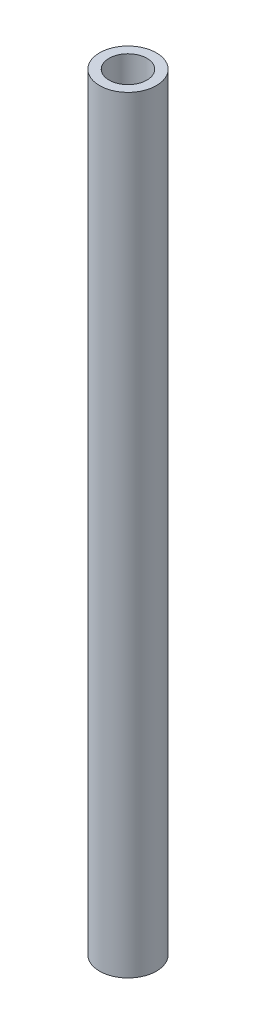
ISO-10303-21;
HEADER;
FILE_DESCRIPTION(('STEP AP214'),'2;1');
FILE_NAME('part.step','',(''),(''),'','','');
FILE_SCHEMA(('AUTOMOTIVE_DESIGN { 1 0 10303 214 1 1 1 1 }'));
ENDSEC;
DATA;
#1=APPLICATION_CONTEXT('core data for automotive mechanical design processes');
#2=APPLICATION_PROTOCOL_DEFINITION('international standard','automotive_design',2000,#1);
#3=PRODUCT_CONTEXT('',#1,'mechanical');
#4=PRODUCT('Part','Part','',(#3));
#5=PRODUCT_RELATED_PRODUCT_CATEGORY('part','',(#4));
#6=PRODUCT_DEFINITION_FORMATION('','',#4);
#7=PRODUCT_DEFINITION_CONTEXT('part definition',#1,'design');
#8=PRODUCT_DEFINITION('design','',#6,#7);
#9=PRODUCT_DEFINITION_SHAPE('','',#8);
#10=(LENGTH_UNIT() NAMED_UNIT(*) SI_UNIT(.MILLI.,.METRE.));
#11=(NAMED_UNIT(*) PLANE_ANGLE_UNIT() SI_UNIT($,.RADIAN.));
#12=(NAMED_UNIT(*) SI_UNIT($,.STERADIAN.) SOLID_ANGLE_UNIT());
#13=UNCERTAINTY_MEASURE_WITH_UNIT(LENGTH_MEASURE(1.E-05),#10,'distance_accuracy_value','');
#14=(GEOMETRIC_REPRESENTATION_CONTEXT(3) GLOBAL_UNCERTAINTY_ASSIGNED_CONTEXT((#13)) GLOBAL_UNIT_ASSIGNED_CONTEXT((#10,
#11,#12)) REPRESENTATION_CONTEXT('',''));
#15=CARTESIAN_POINT('',(0.,0.,0.));
#16=DIRECTION('',(0.,0.,1.));
#17=DIRECTION('',(1.,0.,0.));
#18=AXIS2_PLACEMENT_3D('',#15,#16,#17);
#19=CARTESIAN_POINT('',(-56.2916512459885,-69.6,50.));
#20=DIRECTION('',(0.,1.,0.));
#21=DIRECTION('',(0.,0.,1.));
#22=AXIS2_PLACEMENT_3D('',#19,#20,#21);
#23=PLANE('',#22);
#24=CARTESIAN_POINT('',(-56.2916512459885,-69.6,50.));
#25=DIRECTION('',(0.,1.,0.));
#26=DIRECTION('',(0.,0.,1.));
#27=AXIS2_PLACEMENT_3D('',#24,#25,#26);
#28=CIRCLE('',#27,3.);
#29=CARTESIAN_POINT('',(-56.2916512459885,-69.6,53.));
#30=VERTEX_POINT('',#29);
#31=EDGE_CURVE('E10',#30,#30,#28,.T.);
#32=ORIENTED_EDGE('',*,*,#31,.T.);
#33=EDGE_LOOP('',(#32));
#34=FACE_BOUND('',#33,.T.);
#35=CARTESIAN_POINT('',(-56.2916512459885,-69.6,50.));
#36=DIRECTION('',(0.,1.,0.));
#37=DIRECTION('',(0.,0.,1.));
#38=AXIS2_PLACEMENT_3D('',#35,#36,#37);
#39=CIRCLE('',#38,2.);
#40=CARTESIAN_POINT('',(-56.2916512459885,-69.6,52.));
#41=VERTEX_POINT('',#40);
#42=EDGE_CURVE('E49',#41,#41,#39,.T.);
#43=ORIENTED_EDGE('',*,*,#42,.F.);
#44=EDGE_LOOP('',(#43));
#45=FACE_BOUND('',#44,.T.);
#46=ADVANCED_FACE('F39',(#34,#45),#23,.T.);
#47=CARTESIAN_POINT('',(-56.2916512459885,-150.6,50.));
#48=DIRECTION('',(0.,1.,0.));
#49=DIRECTION('',(0.,0.,1.));
#50=AXIS2_PLACEMENT_3D('',#47,#48,#49);
#51=PLANE('',#50);
#52=CARTESIAN_POINT('',(-56.2916512459885,-150.6,50.));
#53=DIRECTION('',(0.,1.,0.));
#54=DIRECTION('',(0.,0.,1.));
#55=AXIS2_PLACEMENT_3D('',#52,#53,#54);
#56=CIRCLE('',#55,3.);
#57=CARTESIAN_POINT('',(-56.2916512459885,-150.6,53.));
#58=VERTEX_POINT('',#57);
#59=EDGE_CURVE('E43',#58,#58,#56,.T.);
#60=ORIENTED_EDGE('',*,*,#59,.F.);
#61=EDGE_LOOP('',(#60));
#62=FACE_BOUND('',#61,.T.);
#63=CARTESIAN_POINT('',(-56.2916512459885,-150.6,50.));
#64=DIRECTION('',(0.,1.,0.));
#65=DIRECTION('',(0.,0.,1.));
#66=AXIS2_PLACEMENT_3D('',#63,#64,#65);
#67=CIRCLE('',#66,2.);
#68=CARTESIAN_POINT('',(-56.2916512459885,-150.6,52.));
#69=VERTEX_POINT('',#68);
#70=EDGE_CURVE('E55',#69,#69,#67,.T.);
#71=ORIENTED_EDGE('',*,*,#70,.T.);
#72=EDGE_LOOP('',(#71));
#73=FACE_BOUND('',#72,.T.);
#74=ADVANCED_FACE('F61',(#62,#73),#51,.F.);
#75=CARTESIAN_POINT('',(-56.2916512459885,-69.6,50.));
#76=DIRECTION('',(0.,-1.,0.));
#77=DIRECTION('',(0.,0.,-1.));
#78=AXIS2_PLACEMENT_3D('',#75,#76,#77);
#79=CYLINDRICAL_SURFACE('',#78,3.);
#80=ORIENTED_EDGE('',*,*,#31,.F.);
#81=EDGE_LOOP('',(#80));
#82=FACE_BOUND('',#81,.T.);
#83=ORIENTED_EDGE('',*,*,#59,.T.);
#84=EDGE_LOOP('',(#83));
#85=FACE_BOUND('',#84,.T.);
#86=ADVANCED_FACE('F41',(#82,#85),#79,.T.);
#87=CARTESIAN_POINT('',(-56.2916512459885,-69.6,50.));
#88=DIRECTION('',(0.,-1.,0.));
#89=DIRECTION('',(0.,0.,-1.));
#90=AXIS2_PLACEMENT_3D('',#87,#88,#89);
#91=CYLINDRICAL_SURFACE('',#90,2.);
#92=ORIENTED_EDGE('',*,*,#42,.T.);
#93=EDGE_LOOP('',(#92));
#94=FACE_BOUND('',#93,.T.);
#95=ORIENTED_EDGE('',*,*,#70,.F.);
#96=EDGE_LOOP('',(#95));
#97=FACE_BOUND('',#96,.T.);
#98=ADVANCED_FACE('F59',(#94,#97),#91,.F.);
#99=CLOSED_SHELL('',(#46,#74,#86,#98));
#100=MANIFOLD_SOLID_BREP('B2',#99);
#101=ADVANCED_BREP_SHAPE_REPRESENTATION('',(#18,#100),#14);
#102=SHAPE_DEFINITION_REPRESENTATION(#9,#101);
ENDSEC;
END-ISO-10303-21;
